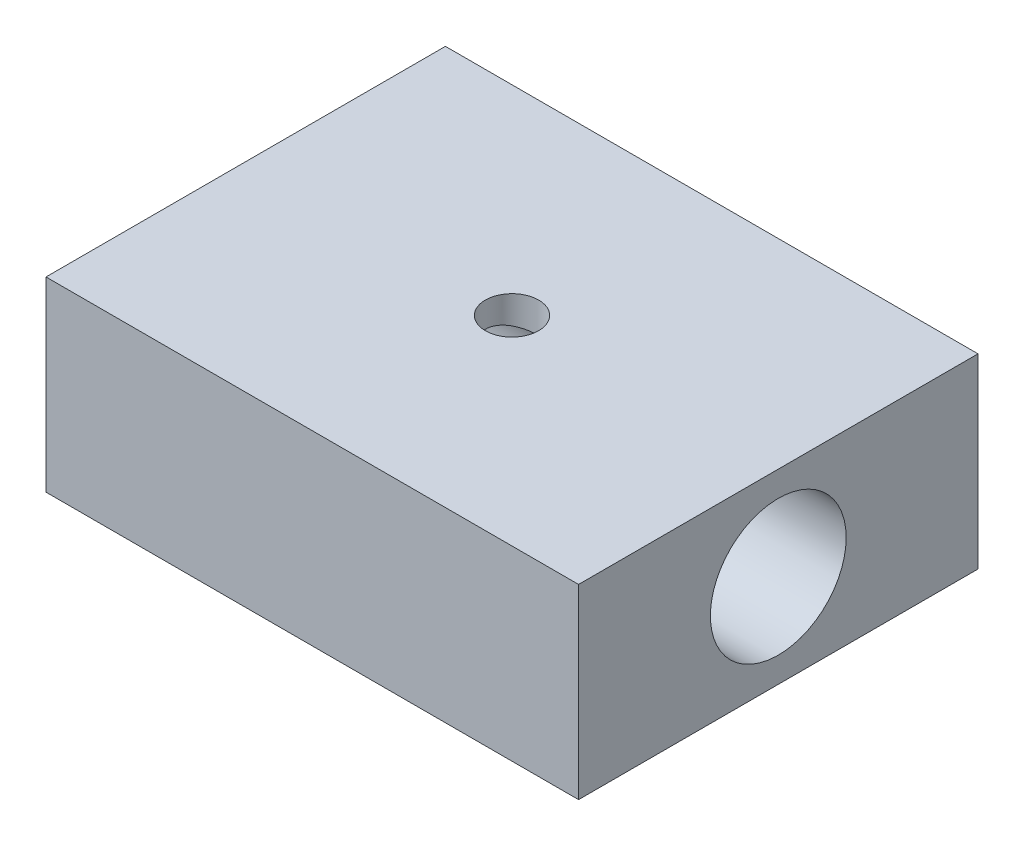
ISO-10303-21;
HEADER;
FILE_DESCRIPTION(('STEP AP214'),'2;1');
FILE_NAME('part.step','',(''),(''),'','','');
FILE_SCHEMA(('AUTOMOTIVE_DESIGN { 1 0 10303 214 1 1 1 1 }'));
ENDSEC;
DATA;
#1=APPLICATION_CONTEXT('core data for automotive mechanical design processes');
#2=APPLICATION_PROTOCOL_DEFINITION('international standard','automotive_design',2000,#1);
#3=PRODUCT_CONTEXT('',#1,'mechanical');
#4=PRODUCT('Part','Part','',(#3));
#5=PRODUCT_RELATED_PRODUCT_CATEGORY('part','',(#4));
#6=PRODUCT_DEFINITION_FORMATION('','',#4);
#7=PRODUCT_DEFINITION_CONTEXT('part definition',#1,'design');
#8=PRODUCT_DEFINITION('design','',#6,#7);
#9=PRODUCT_DEFINITION_SHAPE('','',#8);
#10=(LENGTH_UNIT() NAMED_UNIT(*) SI_UNIT(.MILLI.,.METRE.));
#11=(NAMED_UNIT(*) PLANE_ANGLE_UNIT() SI_UNIT($,.RADIAN.));
#12=(NAMED_UNIT(*) SI_UNIT($,.STERADIAN.) SOLID_ANGLE_UNIT());
#13=UNCERTAINTY_MEASURE_WITH_UNIT(LENGTH_MEASURE(1.E-05),#10,'distance_accuracy_value','');
#14=(GEOMETRIC_REPRESENTATION_CONTEXT(3) GLOBAL_UNCERTAINTY_ASSIGNED_CONTEXT((#13)) GLOBAL_UNIT_ASSIGNED_CONTEXT((#10,
#11,#12)) REPRESENTATION_CONTEXT('',''));
#15=CARTESIAN_POINT('',(0.,0.,0.));
#16=DIRECTION('',(0.,0.,1.));
#17=DIRECTION('',(1.,0.,0.));
#18=AXIS2_PLACEMENT_3D('',#15,#16,#17);
#19=CARTESIAN_POINT('',(40.,0.,0.));
#20=DIRECTION('',(-1.,0.,0.));
#21=DIRECTION('',(0.,0.,1.));
#22=AXIS2_PLACEMENT_3D('',#19,#20,#21);
#23=PLANE('',#22);
#24=DIRECTION('',(0.,-1.,0.));
#25=VECTOR('',#24,1.);
#26=CARTESIAN_POINT('',(40.,0.,0.));
#27=LINE('',#26,#25);
#28=CARTESIAN_POINT('',(40.,14.,0.));
#29=VERTEX_POINT('',#28);
#30=CARTESIAN_POINT('',(40.,0.,0.));
#31=VERTEX_POINT('',#30);
#32=EDGE_CURVE('E98',#29,#31,#27,.T.);
#33=ORIENTED_EDGE('',*,*,#32,.T.);
#34=DIRECTION('',(0.,0.,-1.));
#35=VECTOR('',#34,1.);
#36=CARTESIAN_POINT('',(40.,0.,0.));
#37=LINE('',#36,#35);
#38=CARTESIAN_POINT('',(40.,0.,-30.));
#39=VERTEX_POINT('',#38);
#40=EDGE_CURVE('E93',#31,#39,#37,.T.);
#41=ORIENTED_EDGE('',*,*,#40,.T.);
#42=DIRECTION('',(0.,1.,0.));
#43=VECTOR('',#42,1.);
#44=CARTESIAN_POINT('',(40.,0.,-30.));
#45=LINE('',#44,#43);
#46=CARTESIAN_POINT('',(40.,14.,-30.));
#47=VERTEX_POINT('',#46);
#48=EDGE_CURVE('E96',#39,#47,#45,.T.);
#49=ORIENTED_EDGE('',*,*,#48,.T.);
#50=DIRECTION('',(0.,0.,1.));
#51=VECTOR('',#50,1.);
#52=CARTESIAN_POINT('',(40.,14.,0.));
#53=LINE('',#52,#51);
#54=EDGE_CURVE('E63',#47,#29,#53,.T.);
#55=ORIENTED_EDGE('',*,*,#54,.T.);
#56=EDGE_LOOP('',(#33,#41,#49,#55));
#57=FACE_BOUND('',#56,.T.);
#58=CARTESIAN_POINT('',(40.,7.,-15.));
#59=DIRECTION('',(1.,0.,0.));
#60=DIRECTION('',(0.,0.,-1.));
#61=AXIS2_PLACEMENT_3D('',#58,#59,#60);
#62=CIRCLE('',#61,5.09999999999999);
#63=CARTESIAN_POINT('',(40.,7.,-20.1));
#64=VERTEX_POINT('',#63);
#65=EDGE_CURVE('E119',#64,#64,#62,.T.);
#66=ORIENTED_EDGE('',*,*,#65,.F.);
#67=EDGE_LOOP('',(#66));
#68=FACE_BOUND('',#67,.T.);
#69=ADVANCED_FACE('F38',(#57,#68),#23,.F.);
#70=CARTESIAN_POINT('',(0.,0.,0.));
#71=DIRECTION('',(-1.,0.,0.));
#72=DIRECTION('',(0.,0.,1.));
#73=AXIS2_PLACEMENT_3D('',#70,#71,#72);
#74=PLANE('',#73);
#75=DIRECTION('',(0.,-1.,0.));
#76=VECTOR('',#75,1.);
#77=CARTESIAN_POINT('',(0.,0.,0.));
#78=LINE('',#77,#76);
#79=CARTESIAN_POINT('',(0.,14.,0.));
#80=VERTEX_POINT('',#79);
#81=CARTESIAN_POINT('',(0.,0.,0.));
#82=VERTEX_POINT('',#81);
#83=EDGE_CURVE('E115',#80,#82,#78,.T.);
#84=ORIENTED_EDGE('',*,*,#83,.F.);
#85=DIRECTION('',(0.,0.,1.));
#86=VECTOR('',#85,1.);
#87=CARTESIAN_POINT('',(0.,14.,0.));
#88=LINE('',#87,#86);
#89=CARTESIAN_POINT('',(0.,14.,-30.));
#90=VERTEX_POINT('',#89);
#91=EDGE_CURVE('E86',#90,#80,#88,.T.);
#92=ORIENTED_EDGE('',*,*,#91,.F.);
#93=DIRECTION('',(0.,1.,0.));
#94=VECTOR('',#93,1.);
#95=CARTESIAN_POINT('',(0.,0.,-30.));
#96=LINE('',#95,#94);
#97=CARTESIAN_POINT('',(0.,0.,-30.));
#98=VERTEX_POINT('',#97);
#99=EDGE_CURVE('E80',#98,#90,#96,.T.);
#100=ORIENTED_EDGE('',*,*,#99,.F.);
#101=DIRECTION('',(0.,0.,-1.));
#102=VECTOR('',#101,1.);
#103=CARTESIAN_POINT('',(0.,0.,0.));
#104=LINE('',#103,#102);
#105=EDGE_CURVE('E103',#82,#98,#104,.T.);
#106=ORIENTED_EDGE('',*,*,#105,.F.);
#107=EDGE_LOOP('',(#84,#92,#100,#106));
#108=FACE_BOUND('',#107,.T.);
#109=CARTESIAN_POINT('',(0.,7.,-15.));
#110=DIRECTION('',(1.,0.,0.));
#111=DIRECTION('',(0.,0.,-1.));
#112=AXIS2_PLACEMENT_3D('',#109,#110,#111);
#113=CIRCLE('',#112,5.09999999999999);
#114=CARTESIAN_POINT('',(0.,7.,-20.1));
#115=VERTEX_POINT('',#114);
#116=EDGE_CURVE('E186',#115,#115,#113,.T.);
#117=ORIENTED_EDGE('',*,*,#116,.T.);
#118=EDGE_LOOP('',(#117));
#119=FACE_BOUND('',#118,.T.);
#120=ADVANCED_FACE('F155',(#108,#119),#74,.T.);
#121=CARTESIAN_POINT('',(40.,0.,0.));
#122=DIRECTION('',(0.,0.,-1.));
#123=DIRECTION('',(-1.,0.,0.));
#124=AXIS2_PLACEMENT_3D('',#121,#122,#123);
#125=PLANE('',#124);
#126=ORIENTED_EDGE('',*,*,#83,.T.);
#127=DIRECTION('',(-1.,0.,0.));
#128=VECTOR('',#127,1.);
#129=CARTESIAN_POINT('',(40.,0.,0.));
#130=LINE('',#129,#128);
#131=EDGE_CURVE('E11',#31,#82,#130,.T.);
#132=ORIENTED_EDGE('',*,*,#131,.F.);
#133=ORIENTED_EDGE('',*,*,#32,.F.);
#134=DIRECTION('',(-1.,0.,0.));
#135=VECTOR('',#134,1.);
#136=CARTESIAN_POINT('',(40.,14.,0.));
#137=LINE('',#136,#135);
#138=EDGE_CURVE('E111',#29,#80,#137,.T.);
#139=ORIENTED_EDGE('',*,*,#138,.T.);
#140=EDGE_LOOP('',(#126,#132,#133,#139));
#141=FACE_BOUND('',#140,.T.);
#142=ADVANCED_FACE('F40',(#141),#125,.F.);
#143=CARTESIAN_POINT('',(40.,0.,0.));
#144=DIRECTION('',(0.,1.,0.));
#145=DIRECTION('',(0.,0.,1.));
#146=AXIS2_PLACEMENT_3D('',#143,#144,#145);
#147=PLANE('',#146);
#148=CARTESIAN_POINT('',(20.,0.,-15.));
#149=DIRECTION('',(0.,1.,0.));
#150=DIRECTION('',(0.,0.,1.));
#151=AXIS2_PLACEMENT_3D('',#148,#149,#150);
#152=CIRCLE('',#151,2.);
#153=CARTESIAN_POINT('',(20.,0.,-13.));
#154=VERTEX_POINT('',#153);
#155=EDGE_CURVE('E135',#154,#154,#152,.T.);
#156=ORIENTED_EDGE('',*,*,#155,.T.);
#157=EDGE_LOOP('',(#156));
#158=FACE_BOUND('',#157,.T.);
#159=ORIENTED_EDGE('',*,*,#105,.T.);
#160=DIRECTION('',(-1.,0.,0.));
#161=VECTOR('',#160,1.);
#162=CARTESIAN_POINT('',(40.,0.,-30.));
#163=LINE('',#162,#161);
#164=EDGE_CURVE('E54',#39,#98,#163,.T.);
#165=ORIENTED_EDGE('',*,*,#164,.F.);
#166=ORIENTED_EDGE('',*,*,#40,.F.);
#167=ORIENTED_EDGE('',*,*,#131,.T.);
#168=EDGE_LOOP('',(#159,#165,#166,#167));
#169=FACE_BOUND('',#168,.T.);
#170=ADVANCED_FACE('F102',(#158,#169),#147,.F.);
#171=CARTESIAN_POINT('',(40.,0.,-30.));
#172=DIRECTION('',(0.,0.,1.));
#173=DIRECTION('',(0.,-1.,0.));
#174=AXIS2_PLACEMENT_3D('',#171,#172,#173);
#175=PLANE('',#174);
#176=ORIENTED_EDGE('',*,*,#99,.T.);
#177=DIRECTION('',(-1.,0.,0.));
#178=VECTOR('',#177,1.);
#179=CARTESIAN_POINT('',(40.,14.,-30.));
#180=LINE('',#179,#178);
#181=EDGE_CURVE('E105',#47,#90,#180,.T.);
#182=ORIENTED_EDGE('',*,*,#181,.F.);
#183=ORIENTED_EDGE('',*,*,#48,.F.);
#184=ORIENTED_EDGE('',*,*,#164,.T.);
#185=EDGE_LOOP('',(#176,#182,#183,#184));
#186=FACE_BOUND('',#185,.T.);
#187=ADVANCED_FACE('F107',(#186),#175,.F.);
#188=CARTESIAN_POINT('',(40.,14.,0.));
#189=DIRECTION('',(0.,-1.,0.));
#190=DIRECTION('',(0.,0.,-1.));
#191=AXIS2_PLACEMENT_3D('',#188,#189,#190);
#192=PLANE('',#191);
#193=CARTESIAN_POINT('',(20.,14.,-15.));
#194=DIRECTION('',(0.,1.,0.));
#195=DIRECTION('',(0.,0.,1.));
#196=AXIS2_PLACEMENT_3D('',#193,#194,#195);
#197=CIRCLE('',#196,2.);
#198=CARTESIAN_POINT('',(20.,14.,-13.));
#199=VERTEX_POINT('',#198);
#200=EDGE_CURVE('E177',#199,#199,#197,.T.);
#201=ORIENTED_EDGE('',*,*,#200,.F.);
#202=EDGE_LOOP('',(#201));
#203=FACE_BOUND('',#202,.T.);
#204=ORIENTED_EDGE('',*,*,#91,.T.);
#205=ORIENTED_EDGE('',*,*,#138,.F.);
#206=ORIENTED_EDGE('',*,*,#54,.F.);
#207=ORIENTED_EDGE('',*,*,#181,.T.);
#208=EDGE_LOOP('',(#204,#205,#206,#207));
#209=FACE_BOUND('',#208,.T.);
#210=ADVANCED_FACE('F151',(#203,#209),#192,.F.);
#211=CARTESIAN_POINT('',(40.,7.,-15.));
#212=DIRECTION('',(-1.,0.,0.));
#213=DIRECTION('',(0.,0.,1.));
#214=AXIS2_PLACEMENT_3D('',#211,#212,#213);
#215=CYLINDRICAL_SURFACE('',#214,5.09999999999999);
#216=CARTESIAN_POINT('',(20.,2.30851835770405,-13.));
#217=CARTESIAN_POINT('',(20.1073315271608,2.30850809500743,-13.0000113170559));
#218=CARTESIAN_POINT('',(20.2148255312044,2.30478314837678,-13.0086915406865));
#219=CARTESIAN_POINT('',(20.4267415922627,2.29034534805329,-13.043094701131));
#220=CARTESIAN_POINT('',(20.5311548685092,2.27961422237703,-13.0688622040145));
#221=CARTESIAN_POINT('',(20.7334894245807,2.25258111696266,-13.1363156659354));
#222=CARTESIAN_POINT('',(20.831433033061,2.23629963738713,-13.1779431120913));
#223=CARTESIAN_POINT('',(21.0189213745972,2.20002892042289,-13.2757646606028));
#224=CARTESIAN_POINT('',(21.108468176438,2.18004059994968,-13.3319551620387));
#225=CARTESIAN_POINT('',(21.281594216585,2.13737808585782,-13.4606114421585));
#226=CARTESIAN_POINT('',(21.3646541768714,2.11461970695097,-13.5337483847896));
#227=CARTESIAN_POINT('',(21.5177073290004,2.06967818653561,-13.6928075194239));
#228=CARTESIAN_POINT('',(21.5876960456447,2.04749524426932,-13.7787340721756));
#229=CARTESIAN_POINT('',(21.7151640105653,2.00519963915194,-13.9649121750699));
#230=CARTESIAN_POINT('',(21.7720728736872,1.98519640776562,-14.0655813438323));
#231=CARTESIAN_POINT('',(21.8679282765875,1.95052972950665,-14.2759881822634));
#232=CARTESIAN_POINT('',(21.9068818576534,1.93586418989687,-14.3857222771171));
#233=CARTESIAN_POINT('',(21.9638813762635,1.91412071196426,-14.6057036970619));
#234=CARTESIAN_POINT('',(21.9828193275703,1.90672020765886,-14.7156873745215));
#235=CARTESIAN_POINT('',(22.0021177755124,1.89917739340284,-14.9375039003133));
#236=CARTESIAN_POINT('',(22.002484922169,1.89903248529522,-15.0493360723678));
#237=CARTESIAN_POINT('',(21.9851301834909,1.90581802720313,-15.2652443975656));
#238=CARTESIAN_POINT('',(21.9683844915572,1.91236665196866,-15.3694131637921));
#239=CARTESIAN_POINT('',(21.9189339686158,1.93129321921911,-15.5733249704238));
#240=CARTESIAN_POINT('',(21.8862279706083,1.94367158796616,-15.6730676866192));
#241=CARTESIAN_POINT('',(21.8053798720052,1.97327489154682,-15.8670732474461));
#242=CARTESIAN_POINT('',(21.7570144841426,1.99056946250919,-15.9612319762512));
#243=CARTESIAN_POINT('',(21.6464258295747,2.02827800022062,-16.1403374460573));
#244=CARTESIAN_POINT('',(21.5841978958463,2.04869301678383,-16.2252810703075));
#245=CARTESIAN_POINT('',(21.4430482235682,2.09208781184279,-16.3892599809419));
#246=CARTESIAN_POINT('',(21.3633182546846,2.11514813693671,-16.4675792957186));
#247=CARTESIAN_POINT('',(21.1917498236872,2.16022472920442,-16.6100215746566));
#248=CARTESIAN_POINT('',(21.099907718364,2.18224067952077,-16.6741402517985));
#249=CARTESIAN_POINT('',(20.9036422168097,2.22327094377424,-16.7879105688354));
#250=CARTESIAN_POINT('',(20.7989519453511,2.24219134726555,-16.8371384940359));
#251=CARTESIAN_POINT('',(20.5818282154747,2.27379295256328,-16.9169853944683));
#252=CARTESIAN_POINT('',(20.4693996027436,2.28647801908695,-16.9476158993227));
#253=CARTESIAN_POINT('',(20.2471135673503,2.3032432910288,-16.9876930180224));
#254=CARTESIAN_POINT('',(20.1374985889922,2.30778886855833,-16.998287409779));
#255=CARTESIAN_POINT('',(19.9179868049199,2.30908379448341,-17.0013277436645));
#256=CARTESIAN_POINT('',(19.8080900885353,2.30583536681776,-16.9937788627877));
#257=CARTESIAN_POINT('',(19.5973487854066,2.29238435845245,-16.9617906925215));
#258=CARTESIAN_POINT('',(19.4963353929458,2.28256560130626,-16.9382826543196));
#259=CARTESIAN_POINT('',(19.2997468697997,2.25754973107056,-16.8762398694506));
#260=CARTESIAN_POINT('',(19.2041729207941,2.24235145445716,-16.8377018718045));
#261=CARTESIAN_POINT('',(19.0169559030048,2.20755070088663,-16.7449834404901));
#262=CARTESIAN_POINT('',(18.9256187565618,2.18779754403951,-16.6902435796068));
#263=CARTESIAN_POINT('',(18.7530224952983,2.1463498589797,-16.5672544739623));
#264=CARTESIAN_POINT('',(18.6717673777014,2.12465456659932,-16.4989998986824));
#265=CARTESIAN_POINT('',(18.5156934487126,2.07992049301637,-16.3452360796423));
#266=CARTESIAN_POINT('',(18.4417317497805,2.05689477843615,-16.2588498396619));
#267=CARTESIAN_POINT('',(18.3092312440566,2.01354120964222,-16.0743365079189));
#268=CARTESIAN_POINT('',(18.2506928633954,1.99321342997739,-15.9762090918684));
#269=CARTESIAN_POINT('',(18.1509770609569,1.95750901655004,-15.7707942598128));
#270=CARTESIAN_POINT('',(18.1097759549258,1.94212563513549,-15.6635195824513));
#271=CARTESIAN_POINT('',(18.0462641928421,1.91805053205661,-15.4428134014033));
#272=CARTESIAN_POINT('',(18.0239437282088,1.90935533606211,-15.3293851271719));
#273=CARTESIAN_POINT('',(17.9999582444324,1.89999432468762,-15.1073030365801));
#274=CARTESIAN_POINT('',(17.9970795944713,1.89885680906843,-14.9987991213563));
#275=CARTESIAN_POINT('',(18.0088811093874,1.90347924767438,-14.7829118453266));
#276=CARTESIAN_POINT('',(18.0235587920982,1.90923822685274,-14.6755283282806));
#277=CARTESIAN_POINT('',(18.0691927070562,1.92677682477331,-14.468073287197));
#278=CARTESIAN_POINT('',(18.0996708135288,1.93837933728508,-14.3678804378744));
#279=CARTESIAN_POINT('',(18.1755468229655,1.9663740754446,-14.1740398843268));
#280=CARTESIAN_POINT('',(18.2209475275447,1.98276720043266,-14.0803934131457));
#281=CARTESIAN_POINT('',(18.3276173323513,2.01961307027963,-13.8978212390092));
#282=CARTESIAN_POINT('',(18.3894920132905,2.04021165709857,-13.8092794052649));
#283=CARTESIAN_POINT('',(18.5264328320092,2.08297106383441,-13.6434710101586));
#284=CARTESIAN_POINT('',(18.6015041214696,2.10513249182125,-13.5662088737963));
#285=CARTESIAN_POINT('',(18.7679460466921,2.15013703232608,-13.4204462091334));
#286=CARTESIAN_POINT('',(18.8600168685763,2.17294325981627,-13.3527311997354));
#287=CARTESIAN_POINT('',(19.0549566881615,2.21522365369615,-13.2336688343102));
#288=CARTESIAN_POINT('',(19.1578271326527,2.2346973727191,-13.1823236750276));
#289=CARTESIAN_POINT('',(19.3622755382168,2.26635468122598,-13.1014950833824));
#290=CARTESIAN_POINT('',(19.4631781386217,2.27902725901464,-13.0704912057652));
#291=CARTESIAN_POINT('',(19.6690097379711,2.29796380308629,-13.0247805816707));
#292=CARTESIAN_POINT('',(19.7739265014304,2.30424584925314,-13.0100278481178));
#293=CARTESIAN_POINT('',(19.9194752111881,2.30800304558902,-13.0012120571759));
#294=CARTESIAN_POINT('',(19.9597261675205,2.30852220855884,-12.9999957535197));
#295=CARTESIAN_POINT('',(20.,2.30851835770405,-13.));
#296=B_SPLINE_CURVE_WITH_KNOTS('',3,(#216,#217,#218,#219,#220,#221,#222,#223,#224,#225,#226,
#227,#228,#229,#230,#231,#232,#233,#234,#235,#236,#237,#238,#239,#240,#241,#242,#243,#244,#245,
#246,#247,#248,#249,#250,#251,#252,#253,#254,#255,#256,#257,#258,#259,#260,#261,#262,#263,#264,
#265,#266,#267,#268,#269,#270,#271,#272,#273,#274,#275,#276,#277,#278,#279,#280,#281,#282,#283,
#284,#285,#286,#287,#288,#289,#290,#291,#292,#293,#294,#295),.UNSPECIFIED.,.T.,.F.,(4,2,2,2,2,2,
2,2,2,2,2,2,2,2,2,2,2,2,2,2,2,2,2,2,2,2,2,2,2,2,2,2,2,2,2,2,2,2,2,4),(0.,0.321873118007116,
0.64458904640937,0.966125714661646,1.28758295418594,1.62504906019072,1.96263049341685,
2.3129255336373,2.66308308612495,2.99687651402516,3.33055041295608,3.64619748634823,
3.96186764296412,4.28225330021832,4.6027469833052,4.94355894733683,5.28447365900743,
5.6343330458018,5.98397531235049,6.3128980344958,6.64172691310554,6.95285184348961,
7.2640441075293,7.58756997964854,7.91122371302846,8.25768589219792,8.60415764276124,
8.95015453343389,9.29597156653151,9.61998414605211,9.94395092112635,10.2586417715133,
10.5733917367164,10.9018654237185,11.2304676259244,11.5784506402441,11.9264803323489,
12.2440397048368,12.560698128854,12.6814740497524),.UNSPECIFIED.);
#297=CARTESIAN_POINT('',(20.,2.30851835770405,-13.));
#298=VERTEX_POINT('',#297);
#299=EDGE_CURVE('E42',#298,#298,#296,.T.);
#300=ORIENTED_EDGE('',*,*,#299,.F.);
#301=EDGE_LOOP('',(#300));
#302=FACE_BOUND('',#301,.T.);
#303=CARTESIAN_POINT('',(20.,11.6914816422959,-13.));
#304=CARTESIAN_POINT('',(19.8926684728392,11.6914919049926,-13.0000113170559));
#305=CARTESIAN_POINT('',(19.7851744687956,11.6952168516232,-13.0086915406865));
#306=CARTESIAN_POINT('',(19.5732584077373,11.7096546519467,-13.043094701131));
#307=CARTESIAN_POINT('',(19.4688451314908,11.720385777623,-13.0688622040145));
#308=CARTESIAN_POINT('',(19.2665105754193,11.7474188830373,-13.1363156659354));
#309=CARTESIAN_POINT('',(19.168566966939,11.7637003626129,-13.1779431120913));
#310=CARTESIAN_POINT('',(18.9810786254028,11.7999710795771,-13.2757646606028));
#311=CARTESIAN_POINT('',(18.891531823562,11.8199594000503,-13.3319551620387));
#312=CARTESIAN_POINT('',(18.718405783415,11.8626219141422,-13.4606114421585));
#313=CARTESIAN_POINT('',(18.6353458231286,11.885380293049,-13.5337483847896));
#314=CARTESIAN_POINT('',(18.4822926709996,11.9303218134644,-13.6928075194239));
#315=CARTESIAN_POINT('',(18.4123039543553,11.9525047557307,-13.7787340721756));
#316=CARTESIAN_POINT('',(18.2848359894347,11.9948003608481,-13.9649121750699));
#317=CARTESIAN_POINT('',(18.2279271263128,12.0148035922344,-14.0655813438323));
#318=CARTESIAN_POINT('',(18.1320717234125,12.0494702704933,-14.2759881822634));
#319=CARTESIAN_POINT('',(18.0931181423466,12.0641358101031,-14.3857222771171));
#320=CARTESIAN_POINT('',(18.0361186237365,12.0858792880357,-14.6057036970619));
#321=CARTESIAN_POINT('',(18.0171806724297,12.0932797923411,-14.7156873745215));
#322=CARTESIAN_POINT('',(17.9978822244876,12.1008226065972,-14.9375039003133));
#323=CARTESIAN_POINT('',(17.997515077831,12.1009675147048,-15.0493360723678));
#324=CARTESIAN_POINT('',(18.0148698165091,12.0941819727969,-15.2652443975656));
#325=CARTESIAN_POINT('',(18.0316155084428,12.0876333480313,-15.3694131637921));
#326=CARTESIAN_POINT('',(18.0810660313842,12.0687067807809,-15.5733249704238));
#327=CARTESIAN_POINT('',(18.1137720293917,12.0563284120338,-15.6730676866192));
#328=CARTESIAN_POINT('',(18.1946201279948,12.0267251084532,-15.8670732474461));
#329=CARTESIAN_POINT('',(18.2429855158574,12.0094305374908,-15.9612319762512));
#330=CARTESIAN_POINT('',(18.3535741704253,11.9717219997794,-16.1403374460573));
#331=CARTESIAN_POINT('',(18.4158021041537,11.9513069832162,-16.2252810703075));
#332=CARTESIAN_POINT('',(18.5569517764318,11.9079121881572,-16.3892599809419));
#333=CARTESIAN_POINT('',(18.6366817453154,11.8848518630633,-16.4675792957186));
#334=CARTESIAN_POINT('',(18.8082501763128,11.8397752707956,-16.6100215746566));
#335=CARTESIAN_POINT('',(18.900092281636,11.8177593204792,-16.6741402517985));
#336=CARTESIAN_POINT('',(19.0963577831903,11.7767290562258,-16.7879105688354));
#337=CARTESIAN_POINT('',(19.2010480546489,11.7578086527345,-16.8371384940359));
#338=CARTESIAN_POINT('',(19.4181717845253,11.7262070474367,-16.9169853944683));
#339=CARTESIAN_POINT('',(19.5306003972564,11.7135219809131,-16.9476158993227));
#340=CARTESIAN_POINT('',(19.7528864326497,11.6967567089712,-16.9876930180224));
#341=CARTESIAN_POINT('',(19.8625014110078,11.6922111314417,-16.998287409779));
#342=CARTESIAN_POINT('',(20.0820131950801,11.6909162055166,-17.0013277436645));
#343=CARTESIAN_POINT('',(20.1919099114647,11.6941646331822,-16.9937788627877));
#344=CARTESIAN_POINT('',(20.4026512145934,11.7076156415475,-16.9617906925215));
#345=CARTESIAN_POINT('',(20.5036646070542,11.7174343986937,-16.9382826543196));
#346=CARTESIAN_POINT('',(20.7002531302003,11.7424502689294,-16.8762398694506));
#347=CARTESIAN_POINT('',(20.7958270792059,11.7576485455428,-16.8377018718045));
#348=CARTESIAN_POINT('',(20.9830440969952,11.7924492991134,-16.7449834404901));
#349=CARTESIAN_POINT('',(21.0743812434382,11.8122024559605,-16.6902435796068));
#350=CARTESIAN_POINT('',(21.2469775047017,11.8536501410203,-16.5672544739623));
#351=CARTESIAN_POINT('',(21.3282326222986,11.8753454334007,-16.4989998986824));
#352=CARTESIAN_POINT('',(21.4843065512874,11.9200795069836,-16.3452360796423));
#353=CARTESIAN_POINT('',(21.5582682502195,11.9431052215638,-16.2588498396619));
#354=CARTESIAN_POINT('',(21.6907687559434,11.9864587903578,-16.0743365079189));
#355=CARTESIAN_POINT('',(21.7493071366046,12.0067865700226,-15.9762090918684));
#356=CARTESIAN_POINT('',(21.8490229390431,12.04249098345,-15.7707942598128));
#357=CARTESIAN_POINT('',(21.8902240450742,12.0578743648645,-15.6635195824513));
#358=CARTESIAN_POINT('',(21.9537358071579,12.0819494679434,-15.4428134014033));
#359=CARTESIAN_POINT('',(21.9760562717912,12.0906446639379,-15.3293851271719));
#360=CARTESIAN_POINT('',(22.0000417555676,12.1000056753124,-15.1073030365801));
#361=CARTESIAN_POINT('',(22.0029204055287,12.1011431909316,-14.9987991213563));
#362=CARTESIAN_POINT('',(21.9911188906126,12.0965207523256,-14.7829118453266));
#363=CARTESIAN_POINT('',(21.9764412079018,12.0907617731473,-14.6755283282806));
#364=CARTESIAN_POINT('',(21.9308072929438,12.0732231752267,-14.468073287197));
#365=CARTESIAN_POINT('',(21.9003291864712,12.0616206627149,-14.3678804378744));
#366=CARTESIAN_POINT('',(21.8244531770345,12.0336259245554,-14.1740398843268));
#367=CARTESIAN_POINT('',(21.7790524724553,12.0172327995673,-14.0803934131457));
#368=CARTESIAN_POINT('',(21.6723826676487,11.9803869297204,-13.8978212390092));
#369=CARTESIAN_POINT('',(21.6105079867095,11.9597883429014,-13.8092794052649));
#370=CARTESIAN_POINT('',(21.4735671679908,11.9170289361656,-13.6434710101586));
#371=CARTESIAN_POINT('',(21.3984958785304,11.8948675081788,-13.5662088737963));
#372=CARTESIAN_POINT('',(21.2320539533079,11.8498629676739,-13.4204462091334));
#373=CARTESIAN_POINT('',(21.1399831314237,11.8270567401837,-13.3527311997354));
#374=CARTESIAN_POINT('',(20.9450433118385,11.7847763463038,-13.2336688343102));
#375=CARTESIAN_POINT('',(20.8421728673473,11.7653026272809,-13.1823236750276));
#376=CARTESIAN_POINT('',(20.6377244617832,11.733645318774,-13.1014950833824));
#377=CARTESIAN_POINT('',(20.5368218613783,11.7209727409854,-13.0704912057652));
#378=CARTESIAN_POINT('',(20.3309902620289,11.7020361969137,-13.0247805816707));
#379=CARTESIAN_POINT('',(20.2260734985696,11.6957541507469,-13.0100278481178));
#380=CARTESIAN_POINT('',(20.0805247888119,11.691996954411,-13.0012120571759));
#381=CARTESIAN_POINT('',(20.0402738324795,11.6914777914412,-12.9999957535197));
#382=CARTESIAN_POINT('',(20.,11.6914816422959,-13.));
#383=B_SPLINE_CURVE_WITH_KNOTS('',3,(#303,#304,#305,#306,#307,#308,#309,#310,#311,#312,#313,
#314,#315,#316,#317,#318,#319,#320,#321,#322,#323,#324,#325,#326,#327,#328,#329,#330,#331,#332,
#333,#334,#335,#336,#337,#338,#339,#340,#341,#342,#343,#344,#345,#346,#347,#348,#349,#350,#351,
#352,#353,#354,#355,#356,#357,#358,#359,#360,#361,#362,#363,#364,#365,#366,#367,#368,#369,#370,
#371,#372,#373,#374,#375,#376,#377,#378,#379,#380,#381,#382),.UNSPECIFIED.,.T.,.F.,(4,2,2,2,2,2,
2,2,2,2,2,2,2,2,2,2,2,2,2,2,2,2,2,2,2,2,2,2,2,2,2,2,2,2,2,2,2,2,2,4),(0.,0.321873118007116,
0.64458904640937,0.966125714661646,1.28758295418594,1.62504906019072,1.96263049341685,
2.3129255336373,2.66308308612495,2.99687651402516,3.33055041295608,3.64619748634823,
3.96186764296412,4.28225330021832,4.6027469833052,4.94355894733683,5.28447365900743,
5.6343330458018,5.98397531235049,6.3128980344958,6.64172691310554,6.95285184348961,
7.26404410752929,7.58756997964854,7.91122371302846,8.25768589219792,8.60415764276124,
8.95015453343389,9.29597156653151,9.61998414605211,9.94395092112635,10.2586417715133,
10.5733917367164,10.9018654237185,11.2304676259244,11.5784506402441,11.9264803323489,
12.2440397048368,12.560698128854,12.6814740497524),.UNSPECIFIED.);
#384=CARTESIAN_POINT('',(20.,11.6914816422959,-13.));
#385=VERTEX_POINT('',#384);
#386=EDGE_CURVE('E129',#385,#385,#383,.T.);
#387=ORIENTED_EDGE('',*,*,#386,.F.);
#388=EDGE_LOOP('',(#387));
#389=FACE_BOUND('',#388,.T.);
#390=ORIENTED_EDGE('',*,*,#65,.T.);
#391=EDGE_LOOP('',(#390));
#392=FACE_BOUND('',#391,.T.);
#393=ORIENTED_EDGE('',*,*,#116,.F.);
#394=EDGE_LOOP('',(#393));
#395=FACE_BOUND('',#394,.T.);
#396=ADVANCED_FACE('F136',(#302,#389,#392,#395),#215,.F.);
#397=CARTESIAN_POINT('',(20.,0.,-15.));
#398=DIRECTION('',(0.,1.,0.));
#399=DIRECTION('',(0.,0.,1.));
#400=AXIS2_PLACEMENT_3D('',#397,#398,#399);
#401=CYLINDRICAL_SURFACE('',#400,2.);
#402=ORIENTED_EDGE('',*,*,#386,.T.);
#403=EDGE_LOOP('',(#402));
#404=FACE_BOUND('',#403,.T.);
#405=ORIENTED_EDGE('',*,*,#200,.T.);
#406=EDGE_LOOP('',(#405));
#407=FACE_BOUND('',#406,.T.);
#408=ADVANCED_FACE('F139',(#404,#407),#401,.F.);
#409=ORIENTED_EDGE('',*,*,#299,.T.);
#410=EDGE_LOOP('',(#409));
#411=FACE_BOUND('',#410,.T.);
#412=ORIENTED_EDGE('',*,*,#155,.F.);
#413=EDGE_LOOP('',(#412));
#414=FACE_BOUND('',#413,.T.);
#415=ADVANCED_FACE('F142',(#411,#414),#401,.F.);
#416=CLOSED_SHELL('',(#69,#120,#142,#170,#187,#210,#396,#408,#415));
#417=MANIFOLD_SOLID_BREP('B2',#416);
#418=ADVANCED_BREP_SHAPE_REPRESENTATION('',(#18,#417),#14);
#419=SHAPE_DEFINITION_REPRESENTATION(#9,#418);
ENDSEC;
END-ISO-10303-21;
